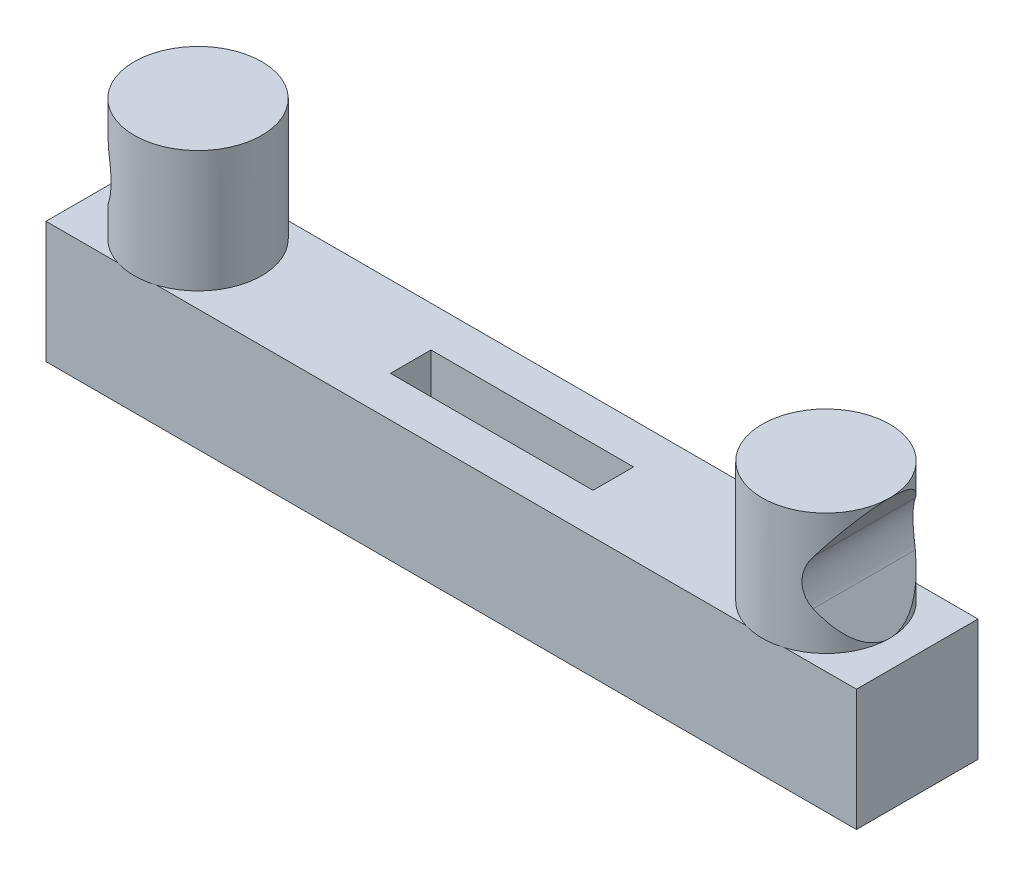
ISO-10303-21;
HEADER;
FILE_DESCRIPTION(('STEP AP214'),'2;1');
FILE_NAME('part.step','',(''),(''),'','','');
FILE_SCHEMA(('AUTOMOTIVE_DESIGN { 1 0 10303 214 1 1 1 1 }'));
ENDSEC;
DATA;
#1=APPLICATION_CONTEXT('core data for automotive mechanical design processes');
#2=APPLICATION_PROTOCOL_DEFINITION('international standard','automotive_design',2000,#1);
#3=PRODUCT_CONTEXT('',#1,'mechanical');
#4=PRODUCT('Part','Part','',(#3));
#5=PRODUCT_RELATED_PRODUCT_CATEGORY('part','',(#4));
#6=PRODUCT_DEFINITION_FORMATION('','',#4);
#7=PRODUCT_DEFINITION_CONTEXT('part definition',#1,'design');
#8=PRODUCT_DEFINITION('design','',#6,#7);
#9=PRODUCT_DEFINITION_SHAPE('','',#8);
#10=(LENGTH_UNIT() NAMED_UNIT(*) SI_UNIT(.MILLI.,.METRE.));
#11=(NAMED_UNIT(*) PLANE_ANGLE_UNIT() SI_UNIT($,.RADIAN.));
#12=(NAMED_UNIT(*) SI_UNIT($,.STERADIAN.) SOLID_ANGLE_UNIT());
#13=UNCERTAINTY_MEASURE_WITH_UNIT(LENGTH_MEASURE(1.E-05),#10,'distance_accuracy_value','');
#14=(GEOMETRIC_REPRESENTATION_CONTEXT(3) GLOBAL_UNCERTAINTY_ASSIGNED_CONTEXT((#13)) GLOBAL_UNIT_ASSIGNED_CONTEXT((#10,
#11,#12)) REPRESENTATION_CONTEXT('',''));
#15=CARTESIAN_POINT('',(0.,0.,0.));
#16=DIRECTION('',(0.,0.,1.));
#17=DIRECTION('',(1.,0.,0.));
#18=AXIS2_PLACEMENT_3D('',#15,#16,#17);
#19=CARTESIAN_POINT('',(0.,7.62,0.));
#20=DIRECTION('',(0.,1.,0.));
#21=DIRECTION('',(0.,0.,1.));
#22=AXIS2_PLACEMENT_3D('',#19,#20,#21);
#23=PLANE('',#22);
#24=CARTESIAN_POINT('',(19.6812405921278,7.62,0.));
#25=DIRECTION('',(0.,-1.,0.));
#26=DIRECTION('',(0.,0.,1.));
#27=AXIS2_PLACEMENT_3D('',#24,#25,#26);
#28=CIRCLE('',#27,4.);
#29=CARTESIAN_POINT('',(20.8993949337447,7.62,-3.81));
#30=VERTEX_POINT('',#29);
#31=CARTESIAN_POINT('',(23.6812405921278,7.62,0.));
#32=VERTEX_POINT('',#31);
#33=EDGE_CURVE('E169',#30,#32,#28,.T.);
#34=ORIENTED_EDGE('',*,*,#33,.T.);
#35=CARTESIAN_POINT('',(20.8993949337447,7.62,3.81));
#36=VERTEX_POINT('',#35);
#37=EDGE_CURVE('E173',#32,#36,#28,.T.);
#38=ORIENTED_EDGE('',*,*,#37,.T.);
#39=DIRECTION('',(1.,0.,0.));
#40=VECTOR('',#39,1.);
#41=CARTESIAN_POINT('',(-25.4,7.62,3.81));
#42=LINE('',#41,#40);
#43=CARTESIAN_POINT('',(25.4,7.62,3.81));
#44=VERTEX_POINT('',#43);
#45=EDGE_CURVE('E325',#36,#44,#42,.T.);
#46=ORIENTED_EDGE('',*,*,#45,.T.);
#47=DIRECTION('',(0.,0.,-1.));
#48=VECTOR('',#47,1.);
#49=CARTESIAN_POINT('',(25.4,7.62,-3.81));
#50=LINE('',#49,#48);
#51=CARTESIAN_POINT('',(25.4,7.62,-3.81));
#52=VERTEX_POINT('',#51);
#53=EDGE_CURVE('E320',#44,#52,#50,.T.);
#54=ORIENTED_EDGE('',*,*,#53,.T.);
#55=DIRECTION('',(-1.,0.,0.));
#56=VECTOR('',#55,1.);
#57=CARTESIAN_POINT('',(-25.4,7.62,-3.81));
#58=LINE('',#57,#56);
#59=EDGE_CURVE('E182',#52,#30,#58,.T.);
#60=ORIENTED_EDGE('',*,*,#59,.T.);
#61=EDGE_LOOP('',(#34,#38,#46,#54,#60));
#62=FACE_BOUND('',#61,.T.);
#63=ADVANCED_FACE('F32',(#62),#23,.T.);
#64=CARTESIAN_POINT('',(-19.6812405921278,15.24,0.));
#65=DIRECTION('',(0.,-1.,0.));
#66=DIRECTION('',(0.,0.,-1.));
#67=AXIS2_PLACEMENT_3D('',#64,#65,#66);
#68=CYLINDRICAL_SURFACE('',#67,4.);
#69=CARTESIAN_POINT('',(-19.6812405921278,9.24,0.));
#70=DIRECTION('',(-0.832050294337843,-0.554700196225229,0.));
#71=DIRECTION('',(0.554700196225229,-0.832050294337844,0.));
#72=AXIS2_PLACEMENT_3D('',#69,#70,#71);
#73=ELLIPSE('',#72,7.21110255092798,4.);
#74=CARTESIAN_POINT('',(-22.0805329244026,12.8389384984121,3.20053062855017));
#75=VERTEX_POINT('',#74);
#76=CARTESIAN_POINT('',(-23.6812405921278,15.24,0.));
#77=VERTEX_POINT('',#76);
#78=EDGE_CURVE('E283',#75,#77,#73,.T.);
#79=ORIENTED_EDGE('',*,*,#78,.F.);
#80=CARTESIAN_POINT('',(-22.0805329244026,12.8389384984121,3.20053062855017));
#81=CARTESIAN_POINT('',(-22.0489067233016,12.7915234511022,3.22423730832494));
#82=CARTESIAN_POINT('',(-22.0185184169344,12.7424586459574,3.24628773190031));
#83=CARTESIAN_POINT('',(-21.9606564488741,12.6413692389897,3.28717532162549));
#84=CARTESIAN_POINT('',(-21.9331824658725,12.5893449644263,3.30601284214193));
#85=CARTESIAN_POINT('',(-21.8816146143263,12.4827355756022,3.34055643539148));
#86=CARTESIAN_POINT('',(-21.8575163664271,12.4281539041404,3.35626657664572));
#87=CARTESIAN_POINT('',(-21.813009586644,12.3167753027886,3.38470889238804));
#88=CARTESIAN_POINT('',(-21.7926010110484,12.2599783991522,3.39744110215646));
#89=CARTESIAN_POINT('',(-21.7373505187254,12.0868096455319,3.43137244625954));
#90=CARTESIAN_POINT('',(-21.7084584277017,11.9676077442597,3.44832266510764));
#91=CARTESIAN_POINT('',(-21.6681802775251,11.7253671703762,3.47168740689977));
#92=CARTESIAN_POINT('',(-21.656792458385,11.6023288847679,3.47810298906537));
#93=CARTESIAN_POINT('',(-21.6520287761371,11.3553873259401,3.48080498701623));
#94=CARTESIAN_POINT('',(-21.6587092400156,11.231482551562,3.47705972676132));
#95=CARTESIAN_POINT('',(-21.6898861260089,10.9866476394987,3.45914195181548));
#96=CARTESIAN_POINT('',(-21.7143929601998,10.8657192829825,3.44496334312906));
#97=CARTESIAN_POINT('',(-21.7801150004832,10.6299871856857,3.40531801349452));
#98=CARTESIAN_POINT('',(-21.8213744349193,10.5152005746636,3.3798213952522));
#99=CARTESIAN_POINT('',(-21.8938916826444,10.3506536739787,3.33241570364247));
#100=CARTESIAN_POINT('',(-21.9198156971138,10.2971083378547,3.31510085465674));
#101=CARTESIAN_POINT('',(-21.9748180571208,10.1928439602977,3.27728817226968));
#102=CARTESIAN_POINT('',(-22.0038949088236,10.142123597468,3.25679184430444));
#103=CARTESIAN_POINT('',(-22.0493994631811,10.0686141688164,3.22368903165787));
#104=CARTESIAN_POINT('',(-22.0648159442359,10.0446320798467,3.21231277329923));
#105=CARTESIAN_POINT('',(-22.0805329244026,10.0210615015879,3.20053062855017));
#106=B_SPLINE_CURVE_WITH_KNOTS('',3,(#80,#81,#82,#83,#84,#85,#86,#87,#88,#89,#90,#91,#92,#93,
#94,#95,#96,#97,#98,#99,#100,#101,#102,#103,#104,#105),.UNSPECIFIED.,.F.,.F.,(4,2,2,2,2,2,2,2,2,
2,2,2,4),(0.,0.1851246104739,0.370228789436317,0.555090562905433,0.739950146156615,
1.10949115199492,1.47899499947704,1.84965208372786,2.2205258364186,2.59238516194598,
2.77808005467902,2.96368734527614,3.05574402558873),.UNSPECIFIED.);
#107=CARTESIAN_POINT('',(-22.0805329244026,10.0210615015879,3.20053062855017));
#108=VERTEX_POINT('',#107);
#109=EDGE_CURVE('E163',#75,#108,#106,.T.);
#110=ORIENTED_EDGE('',*,*,#109,.T.);
#111=CARTESIAN_POINT('',(-19.6812405921278,13.62,0.));
#112=DIRECTION('',(-0.832050294337844,0.554700196225229,0.));
#113=DIRECTION('',(-0.554700196225229,-0.832050294337844,0.));
#114=AXIS2_PLACEMENT_3D('',#111,#112,#113);
#115=ELLIPSE('',#114,7.21110255092798,4.);
#116=CARTESIAN_POINT('',(-23.6812405921278,7.62,0.));
#117=VERTEX_POINT('',#116);
#118=EDGE_CURVE('E278',#117,#108,#115,.T.);
#119=ORIENTED_EDGE('',*,*,#118,.F.);
#120=CARTESIAN_POINT('',(-19.6812405921278,7.62,0.));
#121=DIRECTION('',(0.,1.,0.));
#122=DIRECTION('',(0.,0.,1.));
#123=AXIS2_PLACEMENT_3D('',#120,#121,#122);
#124=CIRCLE('',#123,4.);
#125=CARTESIAN_POINT('',(-20.8993949337447,7.62,3.81));
#126=VERTEX_POINT('',#125);
#127=EDGE_CURVE('E260',#117,#126,#124,.T.);
#128=ORIENTED_EDGE('',*,*,#127,.T.);
#129=CARTESIAN_POINT('',(-18.463086250511,7.62,3.81));
#130=VERTEX_POINT('',#129);
#131=EDGE_CURVE('E270',#126,#130,#124,.T.);
#132=ORIENTED_EDGE('',*,*,#131,.T.);
#133=CARTESIAN_POINT('',(-18.463086250511,7.62,-3.81));
#134=VERTEX_POINT('',#133);
#135=EDGE_CURVE('E271',#130,#134,#124,.T.);
#136=ORIENTED_EDGE('',*,*,#135,.T.);
#137=CARTESIAN_POINT('',(-20.8993949337447,7.62,-3.81));
#138=VERTEX_POINT('',#137);
#139=EDGE_CURVE('E277',#134,#138,#124,.T.);
#140=ORIENTED_EDGE('',*,*,#139,.T.);
#141=EDGE_CURVE('E262',#138,#117,#124,.T.);
#142=ORIENTED_EDGE('',*,*,#141,.T.);
#143=CARTESIAN_POINT('',(-22.0805329244026,10.0210615015879,-3.20053062855017));
#144=VERTEX_POINT('',#143);
#145=EDGE_CURVE('E275',#144,#117,#115,.T.);
#146=ORIENTED_EDGE('',*,*,#145,.F.);
#147=CARTESIAN_POINT('',(-22.0805329244026,10.0210615015879,-3.20053062855017));
#148=CARTESIAN_POINT('',(-22.0489067233016,10.0684765488978,-3.22423730832494));
#149=CARTESIAN_POINT('',(-22.0185184169344,10.1175413540427,-3.24628773190031));
#150=CARTESIAN_POINT('',(-21.9606564488741,10.2186307610103,-3.28717532162549));
#151=CARTESIAN_POINT('',(-21.9331824658725,10.2706550355737,-3.30601284214193));
#152=CARTESIAN_POINT('',(-21.8816146143263,10.3772644243978,-3.34055643539148));
#153=CARTESIAN_POINT('',(-21.8575163664271,10.4318460958596,-3.35626657664572));
#154=CARTESIAN_POINT('',(-21.813009586644,10.5432246972114,-3.38470889238804));
#155=CARTESIAN_POINT('',(-21.7926010110484,10.6000216008478,-3.39744110215646));
#156=CARTESIAN_POINT('',(-21.7373505187254,10.7731903544681,-3.43137244625954));
#157=CARTESIAN_POINT('',(-21.7084584277017,10.8923922557403,-3.44832266510764));
#158=CARTESIAN_POINT('',(-21.6681802775251,11.1346328296238,-3.47168740689977));
#159=CARTESIAN_POINT('',(-21.656792458385,11.2576711152321,-3.47810298906537));
#160=CARTESIAN_POINT('',(-21.6520287761371,11.5046126740599,-3.48080498701623));
#161=CARTESIAN_POINT('',(-21.6587092400156,11.628517448438,-3.47705972676132));
#162=CARTESIAN_POINT('',(-21.6898861260089,11.8733523605013,-3.45914195181548));
#163=CARTESIAN_POINT('',(-21.7143929601998,11.9942807170175,-3.44496334312906));
#164=CARTESIAN_POINT('',(-21.7801150004832,12.2300128143143,-3.40531801349452));
#165=CARTESIAN_POINT('',(-21.8213744349193,12.3447994253364,-3.3798213952522));
#166=CARTESIAN_POINT('',(-21.8938916826444,12.5093463260213,-3.33241570364247));
#167=CARTESIAN_POINT('',(-21.9198156971138,12.5628916621453,-3.31510085465675));
#168=CARTESIAN_POINT('',(-21.9748180571208,12.6671560397023,-3.27728817226968));
#169=CARTESIAN_POINT('',(-22.0038949088236,12.717876402532,-3.25679184430444));
#170=CARTESIAN_POINT('',(-22.0493994631811,12.7913858311836,-3.22368903165787));
#171=CARTESIAN_POINT('',(-22.0648159442359,12.8153679201532,-3.21231277329923));
#172=CARTESIAN_POINT('',(-22.0805329244026,12.8389384984121,-3.20053062855017));
#173=B_SPLINE_CURVE_WITH_KNOTS('',3,(#147,#148,#149,#150,#151,#152,#153,#154,#155,#156,#157,
#158,#159,#160,#161,#162,#163,#164,#165,#166,#167,#168,#169,#170,#171,#172),.UNSPECIFIED.,.F.,
.F.,(4,2,2,2,2,2,2,2,2,2,2,2,4),(0.,0.185124610473902,0.370228789436315,0.555090562905435,
0.739950146156615,1.10949115199492,1.47899499947704,1.84965208372786,2.2205258364186,
2.59238516194598,2.77808005467901,2.96368734527614,3.05574402558873),.UNSPECIFIED.);
#174=CARTESIAN_POINT('',(-22.0805329244026,12.8389384984121,-3.20053062855016));
#175=VERTEX_POINT('',#174);
#176=EDGE_CURVE('E351',#144,#175,#173,.T.);
#177=ORIENTED_EDGE('',*,*,#176,.T.);
#178=EDGE_CURVE('E201',#77,#175,#73,.T.);
#179=ORIENTED_EDGE('',*,*,#178,.F.);
#180=CARTESIAN_POINT('',(-19.6812405921278,15.24,0.));
#181=DIRECTION('',(0.,1.,0.));
#182=DIRECTION('',(0.,0.,1.));
#183=AXIS2_PLACEMENT_3D('',#180,#181,#182);
#184=CIRCLE('',#183,4.);
#185=EDGE_CURVE('E282',#77,#77,#184,.T.);
#186=ORIENTED_EDGE('',*,*,#185,.F.);
#187=EDGE_LOOP('',(#79,#110,#119,#128,#132,#136,#140,#142,#146,#177,#179,#186));
#188=FACE_BOUND('',#187,.T.);
#189=ADVANCED_FACE('F233',(#188),#68,.T.);
#190=CARTESIAN_POINT('',(18.463086250511,7.62,3.81));
#191=VERTEX_POINT('',#190);
#192=CARTESIAN_POINT('',(18.463086250511,7.62,-3.81));
#193=VERTEX_POINT('',#192);
#194=EDGE_CURVE('E180',#191,#193,#28,.T.);
#195=ORIENTED_EDGE('',*,*,#194,.T.);
#196=EDGE_CURVE('E207',#193,#134,#58,.T.);
#197=ORIENTED_EDGE('',*,*,#196,.T.);
#198=ORIENTED_EDGE('',*,*,#135,.F.);
#199=EDGE_CURVE('E210',#130,#191,#42,.T.);
#200=ORIENTED_EDGE('',*,*,#199,.T.);
#201=EDGE_LOOP('',(#195,#197,#198,#200));
#202=FACE_BOUND('',#201,.T.);
#203=DIRECTION('',(0.,0.,-1.));
#204=VECTOR('',#203,1.);
#205=CARTESIAN_POINT('',(6.35,7.62,-1.27));
#206=LINE('',#205,#204);
#207=CARTESIAN_POINT('',(6.35,7.62,1.27));
#208=VERTEX_POINT('',#207);
#209=CARTESIAN_POINT('',(6.35,7.62,-1.27));
#210=VERTEX_POINT('',#209);
#211=EDGE_CURVE('E290',#208,#210,#206,.T.);
#212=ORIENTED_EDGE('',*,*,#211,.F.);
#213=DIRECTION('',(1.,0.,0.));
#214=VECTOR('',#213,1.);
#215=CARTESIAN_POINT('',(-6.35,7.62,1.27));
#216=LINE('',#215,#214);
#217=CARTESIAN_POINT('',(-6.35,7.62,1.27));
#218=VERTEX_POINT('',#217);
#219=EDGE_CURVE('E307',#218,#208,#216,.T.);
#220=ORIENTED_EDGE('',*,*,#219,.F.);
#221=DIRECTION('',(0.,0.,1.));
#222=VECTOR('',#221,1.);
#223=CARTESIAN_POINT('',(-6.35,7.62,-1.27));
#224=LINE('',#223,#222);
#225=CARTESIAN_POINT('',(-6.35,7.62,-1.27));
#226=VERTEX_POINT('',#225);
#227=EDGE_CURVE('E299',#226,#218,#224,.T.);
#228=ORIENTED_EDGE('',*,*,#227,.F.);
#229=DIRECTION('',(-1.,0.,0.));
#230=VECTOR('',#229,1.);
#231=CARTESIAN_POINT('',(-6.35,7.62,-1.27));
#232=LINE('',#231,#230);
#233=EDGE_CURVE('E293',#210,#226,#232,.T.);
#234=ORIENTED_EDGE('',*,*,#233,.F.);
#235=EDGE_LOOP('',(#212,#220,#228,#234));
#236=FACE_BOUND('',#235,.T.);
#237=ADVANCED_FACE('F205',(#202,#236),#23,.T.);
#238=CARTESIAN_POINT('',(25.4,7.62,-3.81));
#239=DIRECTION('',(-1.,0.,0.));
#240=DIRECTION('',(0.,0.,1.));
#241=AXIS2_PLACEMENT_3D('',#238,#239,#240);
#242=PLANE('',#241);
#243=DIRECTION('',(0.,0.,-1.));
#244=VECTOR('',#243,1.);
#245=CARTESIAN_POINT('',(25.4,0.,-3.81));
#246=LINE('',#245,#244);
#247=CARTESIAN_POINT('',(25.4,0.,3.81));
#248=VERTEX_POINT('',#247);
#249=CARTESIAN_POINT('',(25.4,0.,-3.81));
#250=VERTEX_POINT('',#249);
#251=EDGE_CURVE('E313',#248,#250,#246,.T.);
#252=ORIENTED_EDGE('',*,*,#251,.T.);
#253=DIRECTION('',(0.,-1.,0.));
#254=VECTOR('',#253,1.);
#255=CARTESIAN_POINT('',(25.4,7.62,-3.81));
#256=LINE('',#255,#254);
#257=EDGE_CURVE('E268',#52,#250,#256,.T.);
#258=ORIENTED_EDGE('',*,*,#257,.F.);
#259=ORIENTED_EDGE('',*,*,#53,.F.);
#260=DIRECTION('',(0.,-1.,0.));
#261=VECTOR('',#260,1.);
#262=CARTESIAN_POINT('',(25.4,7.62,3.81));
#263=LINE('',#262,#261);
#264=EDGE_CURVE('E327',#44,#248,#263,.T.);
#265=ORIENTED_EDGE('',*,*,#264,.T.);
#266=EDGE_LOOP('',(#252,#258,#259,#265));
#267=FACE_BOUND('',#266,.T.);
#268=ADVANCED_FACE('F244',(#267),#242,.F.);
#269=CARTESIAN_POINT('',(-25.4,7.62,-3.81));
#270=DIRECTION('',(0.,0.,1.));
#271=DIRECTION('',(1.,0.,0.));
#272=AXIS2_PLACEMENT_3D('',#269,#270,#271);
#273=PLANE('',#272);
#274=DIRECTION('',(-1.,0.,0.));
#275=VECTOR('',#274,1.);
#276=CARTESIAN_POINT('',(-25.4,0.,-3.81));
#277=LINE('',#276,#275);
#278=CARTESIAN_POINT('',(-25.4,0.,-3.81));
#279=VERTEX_POINT('',#278);
#280=EDGE_CURVE('E331',#250,#279,#277,.T.);
#281=ORIENTED_EDGE('',*,*,#280,.T.);
#282=DIRECTION('',(0.,-1.,0.));
#283=VECTOR('',#282,1.);
#284=CARTESIAN_POINT('',(-25.4,7.62,-3.81));
#285=LINE('',#284,#283);
#286=CARTESIAN_POINT('',(-25.4,7.62,-3.81));
#287=VERTEX_POINT('',#286);
#288=EDGE_CURVE('E341',#287,#279,#285,.T.);
#289=ORIENTED_EDGE('',*,*,#288,.F.);
#290=EDGE_CURVE('E218',#138,#287,#58,.T.);
#291=ORIENTED_EDGE('',*,*,#290,.F.);
#292=EDGE_CURVE('E215',#134,#138,#58,.T.);
#293=ORIENTED_EDGE('',*,*,#292,.F.);
#294=ORIENTED_EDGE('',*,*,#196,.F.);
#295=DIRECTION('',(-1.,0.,0.));
#296=VECTOR('',#295,1.);
#297=CARTESIAN_POINT('',(-25.4,7.62,-3.81));
#298=LINE('',#297,#296);
#299=EDGE_CURVE('E198',#30,#193,#298,.T.);
#300=ORIENTED_EDGE('',*,*,#299,.F.);
#301=ORIENTED_EDGE('',*,*,#59,.F.);
#302=ORIENTED_EDGE('',*,*,#257,.T.);
#303=EDGE_LOOP('',(#281,#289,#291,#293,#294,#300,#301,#302));
#304=FACE_BOUND('',#303,.T.);
#305=ADVANCED_FACE('F212',(#304),#273,.F.);
#306=CARTESIAN_POINT('',(-25.4,7.62,-3.81));
#307=DIRECTION('',(1.,0.,0.));
#308=DIRECTION('',(0.,0.,-1.));
#309=AXIS2_PLACEMENT_3D('',#306,#307,#308);
#310=PLANE('',#309);
#311=DIRECTION('',(0.,0.,1.));
#312=VECTOR('',#311,1.);
#313=CARTESIAN_POINT('',(-25.4,0.,-3.81));
#314=LINE('',#313,#312);
#315=CARTESIAN_POINT('',(-25.4,0.,3.81));
#316=VERTEX_POINT('',#315);
#317=EDGE_CURVE('E333',#279,#316,#314,.T.);
#318=ORIENTED_EDGE('',*,*,#317,.T.);
#319=DIRECTION('',(0.,-1.,0.));
#320=VECTOR('',#319,1.);
#321=CARTESIAN_POINT('',(-25.4,7.62,3.81));
#322=LINE('',#321,#320);
#323=CARTESIAN_POINT('',(-25.4,7.62,3.81));
#324=VERTEX_POINT('',#323);
#325=EDGE_CURVE('E338',#324,#316,#322,.T.);
#326=ORIENTED_EDGE('',*,*,#325,.F.);
#327=DIRECTION('',(0.,0.,1.));
#328=VECTOR('',#327,1.);
#329=CARTESIAN_POINT('',(-25.4,7.62,-3.81));
#330=LINE('',#329,#328);
#331=EDGE_CURVE('E323',#287,#324,#330,.T.);
#332=ORIENTED_EDGE('',*,*,#331,.F.);
#333=ORIENTED_EDGE('',*,*,#288,.T.);
#334=EDGE_LOOP('',(#318,#326,#332,#333));
#335=FACE_BOUND('',#334,.T.);
#336=ADVANCED_FACE('F255',(#335),#310,.F.);
#337=CARTESIAN_POINT('',(-25.4,7.62,3.81));
#338=DIRECTION('',(0.,0.,-1.));
#339=DIRECTION('',(-1.,0.,0.));
#340=AXIS2_PLACEMENT_3D('',#337,#338,#339);
#341=PLANE('',#340);
#342=DIRECTION('',(1.,0.,0.));
#343=VECTOR('',#342,1.);
#344=CARTESIAN_POINT('',(-25.4,0.,3.81));
#345=LINE('',#344,#343);
#346=EDGE_CURVE('E321',#316,#248,#345,.T.);
#347=ORIENTED_EDGE('',*,*,#346,.T.);
#348=ORIENTED_EDGE('',*,*,#264,.F.);
#349=ORIENTED_EDGE('',*,*,#45,.F.);
#350=EDGE_CURVE('E384',#191,#36,#42,.T.);
#351=ORIENTED_EDGE('',*,*,#350,.F.);
#352=ORIENTED_EDGE('',*,*,#199,.F.);
#353=EDGE_CURVE('E328',#126,#130,#42,.T.);
#354=ORIENTED_EDGE('',*,*,#353,.F.);
#355=EDGE_CURVE('E264',#324,#126,#42,.T.);
#356=ORIENTED_EDGE('',*,*,#355,.F.);
#357=ORIENTED_EDGE('',*,*,#325,.T.);
#358=EDGE_LOOP('',(#347,#348,#349,#351,#352,#354,#356,#357));
#359=FACE_BOUND('',#358,.T.);
#360=ADVANCED_FACE('F247',(#359),#341,.F.);
#361=ORIENTED_EDGE('',*,*,#127,.F.);
#362=ORIENTED_EDGE('',*,*,#141,.F.);
#363=ORIENTED_EDGE('',*,*,#290,.T.);
#364=ORIENTED_EDGE('',*,*,#331,.T.);
#365=ORIENTED_EDGE('',*,*,#355,.T.);
#366=EDGE_LOOP('',(#361,#362,#363,#364,#365));
#367=FACE_BOUND('',#366,.T.);
#368=ADVANCED_FACE('F235',(#367),#23,.T.);
#369=CARTESIAN_POINT('',(0.,0.,0.));
#370=DIRECTION('',(0.,1.,0.));
#371=DIRECTION('',(0.,0.,1.));
#372=AXIS2_PLACEMENT_3D('',#369,#370,#371);
#373=PLANE('',#372);
#374=DIRECTION('',(1.,0.,0.));
#375=VECTOR('',#374,1.);
#376=CARTESIAN_POINT('',(-6.35,0.,1.27));
#377=LINE('',#376,#375);
#378=CARTESIAN_POINT('',(-6.35,0.,1.27));
#379=VERTEX_POINT('',#378);
#380=CARTESIAN_POINT('',(6.35,0.,1.27));
#381=VERTEX_POINT('',#380);
#382=EDGE_CURVE('E302',#379,#381,#377,.T.);
#383=ORIENTED_EDGE('',*,*,#382,.T.);
#384=DIRECTION('',(0.,0.,-1.));
#385=VECTOR('',#384,1.);
#386=CARTESIAN_POINT('',(6.35,0.,-1.27));
#387=LINE('',#386,#385);
#388=CARTESIAN_POINT('',(6.35,0.,-1.27));
#389=VERTEX_POINT('',#388);
#390=EDGE_CURVE('E310',#381,#389,#387,.T.);
#391=ORIENTED_EDGE('',*,*,#390,.T.);
#392=DIRECTION('',(-1.,0.,0.));
#393=VECTOR('',#392,1.);
#394=CARTESIAN_POINT('',(-6.35,0.,-1.27));
#395=LINE('',#394,#393);
#396=CARTESIAN_POINT('',(-6.35,0.,-1.27));
#397=VERTEX_POINT('',#396);
#398=EDGE_CURVE('E583',#389,#397,#395,.T.);
#399=ORIENTED_EDGE('',*,*,#398,.T.);
#400=DIRECTION('',(0.,0.,1.));
#401=VECTOR('',#400,1.);
#402=CARTESIAN_POINT('',(-6.35,0.,-1.27));
#403=LINE('',#402,#401);
#404=EDGE_CURVE('E587',#397,#379,#403,.T.);
#405=ORIENTED_EDGE('',*,*,#404,.T.);
#406=EDGE_LOOP('',(#383,#391,#399,#405));
#407=FACE_BOUND('',#406,.T.);
#408=ORIENTED_EDGE('',*,*,#251,.F.);
#409=ORIENTED_EDGE('',*,*,#346,.F.);
#410=ORIENTED_EDGE('',*,*,#317,.F.);
#411=ORIENTED_EDGE('',*,*,#280,.F.);
#412=EDGE_LOOP('',(#408,#409,#410,#411));
#413=FACE_BOUND('',#412,.T.);
#414=ADVANCED_FACE('F246',(#407,#413),#373,.F.);
#415=CARTESIAN_POINT('',(6.35,0.,-1.27));
#416=DIRECTION('',(1.,0.,0.));
#417=DIRECTION('',(0.,0.,-1.));
#418=AXIS2_PLACEMENT_3D('',#415,#416,#417);
#419=PLANE('',#418);
#420=ORIENTED_EDGE('',*,*,#211,.T.);
#421=DIRECTION('',(0.,1.,0.));
#422=VECTOR('',#421,1.);
#423=CARTESIAN_POINT('',(6.35,0.,-1.27));
#424=LINE('',#423,#422);
#425=EDGE_CURVE('E318',#389,#210,#424,.T.);
#426=ORIENTED_EDGE('',*,*,#425,.F.);
#427=ORIENTED_EDGE('',*,*,#390,.F.);
#428=DIRECTION('',(0.,1.,0.));
#429=VECTOR('',#428,1.);
#430=CARTESIAN_POINT('',(6.35,0.,1.27));
#431=LINE('',#430,#429);
#432=EDGE_CURVE('E311',#381,#208,#431,.T.);
#433=ORIENTED_EDGE('',*,*,#432,.T.);
#434=EDGE_LOOP('',(#420,#426,#427,#433));
#435=FACE_BOUND('',#434,.T.);
#436=ADVANCED_FACE('F253',(#435),#419,.F.);
#437=CARTESIAN_POINT('',(-6.35,0.,1.27));
#438=DIRECTION('',(0.,0.,1.));
#439=DIRECTION('',(1.,0.,0.));
#440=AXIS2_PLACEMENT_3D('',#437,#438,#439);
#441=PLANE('',#440);
#442=ORIENTED_EDGE('',*,*,#219,.T.);
#443=ORIENTED_EDGE('',*,*,#432,.F.);
#444=ORIENTED_EDGE('',*,*,#382,.F.);
#445=DIRECTION('',(0.,1.,0.));
#446=VECTOR('',#445,1.);
#447=CARTESIAN_POINT('',(-6.35,0.,1.27));
#448=LINE('',#447,#446);
#449=EDGE_CURVE('E314',#379,#218,#448,.T.);
#450=ORIENTED_EDGE('',*,*,#449,.T.);
#451=EDGE_LOOP('',(#442,#443,#444,#450));
#452=FACE_BOUND('',#451,.T.);
#453=ADVANCED_FACE('F522',(#452),#441,.F.);
#454=CARTESIAN_POINT('',(-6.35,0.,-1.27));
#455=DIRECTION('',(-1.,0.,0.));
#456=DIRECTION('',(0.,0.,1.));
#457=AXIS2_PLACEMENT_3D('',#454,#455,#456);
#458=PLANE('',#457);
#459=ORIENTED_EDGE('',*,*,#227,.T.);
#460=ORIENTED_EDGE('',*,*,#449,.F.);
#461=ORIENTED_EDGE('',*,*,#404,.F.);
#462=DIRECTION('',(0.,1.,0.));
#463=VECTOR('',#462,1.);
#464=CARTESIAN_POINT('',(-6.35,0.,-1.27));
#465=LINE('',#464,#463);
#466=EDGE_CURVE('E316',#397,#226,#465,.T.);
#467=ORIENTED_EDGE('',*,*,#466,.T.);
#468=EDGE_LOOP('',(#459,#460,#461,#467));
#469=FACE_BOUND('',#468,.T.);
#470=ADVANCED_FACE('F513',(#469),#458,.F.);
#471=CARTESIAN_POINT('',(-6.35,0.,-1.27));
#472=DIRECTION('',(0.,0.,-1.));
#473=DIRECTION('',(-1.,0.,0.));
#474=AXIS2_PLACEMENT_3D('',#471,#472,#473);
#475=PLANE('',#474);
#476=ORIENTED_EDGE('',*,*,#233,.T.);
#477=ORIENTED_EDGE('',*,*,#466,.F.);
#478=ORIENTED_EDGE('',*,*,#398,.F.);
#479=ORIENTED_EDGE('',*,*,#425,.T.);
#480=EDGE_LOOP('',(#476,#477,#478,#479));
#481=FACE_BOUND('',#480,.T.);
#482=ADVANCED_FACE('F397',(#481),#475,.F.);
#483=CARTESIAN_POINT('',(-19.6812405921278,7.62,0.));
#484=DIRECTION('',(0.,1.,0.));
#485=DIRECTION('',(0.,0.,1.));
#486=AXIS2_PLACEMENT_3D('',#483,#484,#485);
#487=PLANE('',#486);
#488=ORIENTED_EDGE('',*,*,#139,.F.);
#489=ORIENTED_EDGE('',*,*,#292,.T.);
#490=EDGE_LOOP('',(#488,#489));
#491=FACE_BOUND('',#490,.T.);
#492=ADVANCED_FACE('F390',(#491),#487,.F.);
#493=ORIENTED_EDGE('',*,*,#131,.F.);
#494=ORIENTED_EDGE('',*,*,#353,.T.);
#495=EDGE_LOOP('',(#493,#494));
#496=FACE_BOUND('',#495,.T.);
#497=ADVANCED_FACE('F387',(#496),#487,.F.);
#498=CARTESIAN_POINT('',(-19.6812405921278,15.24,0.));
#499=DIRECTION('',(0.,1.,0.));
#500=DIRECTION('',(0.,0.,1.));
#501=AXIS2_PLACEMENT_3D('',#498,#499,#500);
#502=PLANE('',#501);
#503=ORIENTED_EDGE('',*,*,#185,.T.);
#504=EDGE_LOOP('',(#503));
#505=FACE_BOUND('',#504,.T.);
#506=ADVANCED_FACE('F389',(#505),#502,.T.);
#507=CARTESIAN_POINT('',(-23.6812405921278,7.62,7.62));
#508=DIRECTION('',(-0.832050294337844,0.554700196225229,0.));
#509=DIRECTION('',(-0.554700196225229,-0.832050294337844,0.));
#510=AXIS2_PLACEMENT_3D('',#507,#508,#509);
#511=PLANE('',#510);
#512=ORIENTED_EDGE('',*,*,#118,.T.);
#513=DIRECTION('',(0.,0.,-1.));
#514=VECTOR('',#513,1.);
#515=CARTESIAN_POINT('',(-22.0805329244026,10.0210615015879,-3.72403007506652));
#516=LINE('',#515,#514);
#517=EDGE_CURVE('E346',#108,#144,#516,.T.);
#518=ORIENTED_EDGE('',*,*,#517,.T.);
#519=ORIENTED_EDGE('',*,*,#145,.T.);
#520=EDGE_LOOP('',(#512,#518,#519));
#521=FACE_BOUND('',#520,.T.);
#522=ADVANCED_FACE('F395',(#521),#511,.T.);
#523=CARTESIAN_POINT('',(-21.1412405921278,11.43,7.62));
#524=DIRECTION('',(-0.832050294337843,-0.554700196225229,0.));
#525=DIRECTION('',(0.554700196225229,-0.832050294337844,0.));
#526=AXIS2_PLACEMENT_3D('',#523,#524,#525);
#527=PLANE('',#526);
#528=ORIENTED_EDGE('',*,*,#178,.T.);
#529=DIRECTION('',(0.,0.,-1.));
#530=VECTOR('',#529,1.);
#531=CARTESIAN_POINT('',(-22.0805329244026,12.8389384984121,3.72403007506653));
#532=LINE('',#531,#530);
#533=EDGE_CURVE('E349',#175,#75,#532,.F.);
#534=ORIENTED_EDGE('',*,*,#533,.T.);
#535=ORIENTED_EDGE('',*,*,#78,.T.);
#536=EDGE_LOOP('',(#528,#534,#535));
#537=FACE_BOUND('',#536,.T.);
#538=ADVANCED_FACE('F229',(#537),#527,.T.);
#539=CARTESIAN_POINT('',(-24.1939406720207,11.43,7.62));
#540=DIRECTION('',(0.,0.,1.));
#541=DIRECTION('',(1.,0.,0.));
#542=AXIS2_PLACEMENT_3D('',#539,#540,#541);
#543=CYLINDRICAL_SURFACE('',#542,2.54);
#544=ORIENTED_EDGE('',*,*,#109,.F.);
#545=ORIENTED_EDGE('',*,*,#533,.F.);
#546=ORIENTED_EDGE('',*,*,#176,.F.);
#547=ORIENTED_EDGE('',*,*,#517,.F.);
#548=EDGE_LOOP('',(#544,#545,#546,#547));
#549=FACE_BOUND('',#548,.T.);
#550=ADVANCED_FACE('F223',(#549),#543,.F.);
#551=CARTESIAN_POINT('',(19.6812405921278,7.62,0.));
#552=DIRECTION('',(0.,1.,0.));
#553=DIRECTION('',(0.,0.,1.));
#554=AXIS2_PLACEMENT_3D('',#551,#552,#553);
#555=PLANE('',#554);
#556=EDGE_CURVE('E184',#193,#30,#28,.T.);
#557=ORIENTED_EDGE('',*,*,#556,.T.);
#558=ORIENTED_EDGE('',*,*,#299,.T.);
#559=EDGE_LOOP('',(#557,#558));
#560=FACE_BOUND('',#559,.T.);
#561=ADVANCED_FACE('F220',(#560),#555,.F.);
#562=EDGE_CURVE('E176',#36,#191,#28,.T.);
#563=ORIENTED_EDGE('',*,*,#562,.T.);
#564=ORIENTED_EDGE('',*,*,#350,.T.);
#565=EDGE_LOOP('',(#563,#564));
#566=FACE_BOUND('',#565,.T.);
#567=ADVANCED_FACE('F222',(#566),#555,.F.);
#568=CARTESIAN_POINT('',(19.6812405921278,15.24,0.));
#569=DIRECTION('',(0.,-1.,0.));
#570=DIRECTION('',(0.,0.,-1.));
#571=AXIS2_PLACEMENT_3D('',#568,#569,#570);
#572=CYLINDRICAL_SURFACE('',#571,4.);
#573=CARTESIAN_POINT('',(19.6812405921278,13.62,0.));
#574=DIRECTION('',(-0.832050294337844,-0.554700196225229,0.));
#575=DIRECTION('',(0.554700196225229,-0.832050294337844,0.));
#576=AXIS2_PLACEMENT_3D('',#573,#574,#575);
#577=ELLIPSE('',#576,7.21110255092798,4.);
#578=CARTESIAN_POINT('',(22.0805329244026,10.0210615015879,-3.20053062855017));
#579=VERTEX_POINT('',#578);
#580=EDGE_CURVE('E160',#32,#579,#577,.F.);
#581=ORIENTED_EDGE('',*,*,#580,.F.);
#582=ORIENTED_EDGE('',*,*,#33,.F.);
#583=ORIENTED_EDGE('',*,*,#556,.F.);
#584=ORIENTED_EDGE('',*,*,#194,.F.);
#585=ORIENTED_EDGE('',*,*,#562,.F.);
#586=ORIENTED_EDGE('',*,*,#37,.F.);
#587=CARTESIAN_POINT('',(22.0805329244026,10.0210615015879,3.20053062855017));
#588=VERTEX_POINT('',#587);
#589=EDGE_CURVE('E158',#588,#32,#577,.F.);
#590=ORIENTED_EDGE('',*,*,#589,.F.);
#591=CARTESIAN_POINT('',(22.0805329244026,10.0210615015879,3.20053062855017));
#592=CARTESIAN_POINT('',(22.0489067233016,10.0684765488978,3.22423730832494));
#593=CARTESIAN_POINT('',(22.0185184169344,10.1175413540427,3.24628773190031));
#594=CARTESIAN_POINT('',(21.9606564488741,10.2186307610103,3.28717532162549));
#595=CARTESIAN_POINT('',(21.9331824658725,10.2706550355737,3.30601284214193));
#596=CARTESIAN_POINT('',(21.8816146143263,10.3772644243978,3.34055643539148));
#597=CARTESIAN_POINT('',(21.8575163664271,10.4318460958596,3.35626657664572));
#598=CARTESIAN_POINT('',(21.813009586644,10.5432246972114,3.38470889238804));
#599=CARTESIAN_POINT('',(21.7926010110484,10.6000216008478,3.39744110215646));
#600=CARTESIAN_POINT('',(21.7373505187254,10.7731903544681,3.43137244625954));
#601=CARTESIAN_POINT('',(21.7084584277017,10.8923922557403,3.44832266510764));
#602=CARTESIAN_POINT('',(21.6681802775251,11.1346328296238,3.47168740689977));
#603=CARTESIAN_POINT('',(21.656792458385,11.2576711152321,3.47810298906537));
#604=CARTESIAN_POINT('',(21.6520287761371,11.5046126740599,3.48080498701623));
#605=CARTESIAN_POINT('',(21.6587092400156,11.628517448438,3.47705972676132));
#606=CARTESIAN_POINT('',(21.6898861260089,11.8733523605013,3.45914195181548));
#607=CARTESIAN_POINT('',(21.7143929601998,11.9942807170175,3.44496334312906));
#608=CARTESIAN_POINT('',(21.7801150004832,12.2300128143143,3.40531801349452));
#609=CARTESIAN_POINT('',(21.8213744349193,12.3447994253364,3.3798213952522));
#610=CARTESIAN_POINT('',(21.8938916826444,12.5093463260213,3.33241570364247));
#611=CARTESIAN_POINT('',(21.9198156971138,12.5628916621453,3.31510085465675));
#612=CARTESIAN_POINT('',(21.9748180571208,12.6671560397023,3.27728817226968));
#613=CARTESIAN_POINT('',(22.0038949088236,12.717876402532,3.25679184430444));
#614=CARTESIAN_POINT('',(22.0493994631811,12.7913858311836,3.22368903165787));
#615=CARTESIAN_POINT('',(22.0648159442359,12.8153679201532,3.21231277329923));
#616=CARTESIAN_POINT('',(22.0805329244026,12.8389384984121,3.20053062855017));
#617=B_SPLINE_CURVE_WITH_KNOTS('',3,(#591,#592,#593,#594,#595,#596,#597,#598,#599,#600,#601,
#602,#603,#604,#605,#606,#607,#608,#609,#610,#611,#612,#613,#614,#615,#616),.UNSPECIFIED.,.F.,
.F.,(4,2,2,2,2,2,2,2,2,2,2,2,4),(0.,0.185124610473902,0.370228789436315,0.555090562905435,
0.739950146156615,1.10949115199492,1.47899499947704,1.84965208372786,2.2205258364186,
2.59238516194598,2.77808005467901,2.96368734527614,3.05574402558873),.UNSPECIFIED.);
#618=CARTESIAN_POINT('',(22.0805329244026,12.8389384984121,3.20053062855017));
#619=VERTEX_POINT('',#618);
#620=EDGE_CURVE('E11',#588,#619,#617,.T.);
#621=ORIENTED_EDGE('',*,*,#620,.T.);
#622=CARTESIAN_POINT('',(19.6812405921278,9.24,0.));
#623=DIRECTION('',(-0.832050294337843,0.554700196225229,0.));
#624=DIRECTION('',(-0.554700196225229,-0.832050294337844,0.));
#625=AXIS2_PLACEMENT_3D('',#622,#623,#624);
#626=ELLIPSE('',#625,7.21110255092798,4.);
#627=CARTESIAN_POINT('',(23.6812405921278,15.24,0.));
#628=VERTEX_POINT('',#627);
#629=EDGE_CURVE('E190',#628,#619,#626,.F.);
#630=ORIENTED_EDGE('',*,*,#629,.F.);
#631=CARTESIAN_POINT('',(19.6812405921278,15.24,0.));
#632=DIRECTION('',(0.,-1.,0.));
#633=DIRECTION('',(0.,0.,1.));
#634=AXIS2_PLACEMENT_3D('',#631,#632,#633);
#635=CIRCLE('',#634,4.);
#636=EDGE_CURVE('E196',#628,#628,#635,.T.);
#637=ORIENTED_EDGE('',*,*,#636,.T.);
#638=CARTESIAN_POINT('',(22.0805329244026,12.8389384984121,-3.20053062855016));
#639=VERTEX_POINT('',#638);
#640=EDGE_CURVE('E187',#639,#628,#626,.F.);
#641=ORIENTED_EDGE('',*,*,#640,.F.);
#642=CARTESIAN_POINT('',(22.0805329244026,12.8389384984121,-3.20053062855017));
#643=CARTESIAN_POINT('',(22.0489067233016,12.7915234511022,-3.22423730832494));
#644=CARTESIAN_POINT('',(22.0185184169344,12.7424586459574,-3.24628773190031));
#645=CARTESIAN_POINT('',(21.9606564488741,12.6413692389897,-3.28717532162549));
#646=CARTESIAN_POINT('',(21.9331824658725,12.5893449644263,-3.30601284214193));
#647=CARTESIAN_POINT('',(21.8816146143263,12.4827355756022,-3.34055643539148));
#648=CARTESIAN_POINT('',(21.8575163664271,12.4281539041404,-3.35626657664572));
#649=CARTESIAN_POINT('',(21.813009586644,12.3167753027886,-3.38470889238804));
#650=CARTESIAN_POINT('',(21.7926010110484,12.2599783991522,-3.39744110215646));
#651=CARTESIAN_POINT('',(21.7373505187254,12.0868096455319,-3.43137244625954));
#652=CARTESIAN_POINT('',(21.7084584277017,11.9676077442597,-3.44832266510764));
#653=CARTESIAN_POINT('',(21.6681802775251,11.7253671703762,-3.47168740689977));
#654=CARTESIAN_POINT('',(21.656792458385,11.6023288847679,-3.47810298906537));
#655=CARTESIAN_POINT('',(21.6520287761371,11.3553873259401,-3.48080498701623));
#656=CARTESIAN_POINT('',(21.6587092400156,11.231482551562,-3.47705972676132));
#657=CARTESIAN_POINT('',(21.6898861260089,10.9866476394987,-3.45914195181548));
#658=CARTESIAN_POINT('',(21.7143929601998,10.8657192829825,-3.44496334312906));
#659=CARTESIAN_POINT('',(21.7801150004832,10.6299871856857,-3.40531801349452));
#660=CARTESIAN_POINT('',(21.8213744349193,10.5152005746636,-3.3798213952522));
#661=CARTESIAN_POINT('',(21.8938916826444,10.3506536739787,-3.33241570364247));
#662=CARTESIAN_POINT('',(21.9198156971138,10.2971083378547,-3.31510085465674));
#663=CARTESIAN_POINT('',(21.9748180571208,10.1928439602977,-3.27728817226968));
#664=CARTESIAN_POINT('',(22.0038949088236,10.142123597468,-3.25679184430444));
#665=CARTESIAN_POINT('',(22.0493994631811,10.0686141688164,-3.22368903165787));
#666=CARTESIAN_POINT('',(22.0648159442359,10.0446320798467,-3.21231277329923));
#667=CARTESIAN_POINT('',(22.0805329244026,10.0210615015879,-3.20053062855017));
#668=B_SPLINE_CURVE_WITH_KNOTS('',3,(#642,#643,#644,#645,#646,#647,#648,#649,#650,#651,#652,
#653,#654,#655,#656,#657,#658,#659,#660,#661,#662,#663,#664,#665,#666,#667),.UNSPECIFIED.,.F.,
.F.,(4,2,2,2,2,2,2,2,2,2,2,2,4),(0.,0.1851246104739,0.370228789436317,0.555090562905433,
0.739950146156615,1.10949115199492,1.47899499947704,1.84965208372786,2.2205258364186,
2.59238516194598,2.77808005467902,2.96368734527614,3.05574402558873),.UNSPECIFIED.);
#669=EDGE_CURVE('E45',#639,#579,#668,.T.);
#670=ORIENTED_EDGE('',*,*,#669,.T.);
#671=EDGE_LOOP('',(#581,#582,#583,#584,#585,#586,#590,#621,#630,#637,#641,#670));
#672=FACE_BOUND('',#671,.T.);
#673=ADVANCED_FACE('F166',(#672),#572,.T.);
#674=CARTESIAN_POINT('',(19.6812405921278,15.24,0.));
#675=DIRECTION('',(0.,1.,0.));
#676=DIRECTION('',(0.,0.,1.));
#677=AXIS2_PLACEMENT_3D('',#674,#675,#676);
#678=PLANE('',#677);
#679=ORIENTED_EDGE('',*,*,#636,.F.);
#680=EDGE_LOOP('',(#679));
#681=FACE_BOUND('',#680,.T.);
#682=ADVANCED_FACE('F406',(#681),#678,.T.);
#683=CARTESIAN_POINT('',(21.1412405921278,11.43,7.62));
#684=DIRECTION('',(-0.832050294337843,0.554700196225229,0.));
#685=DIRECTION('',(-0.554700196225229,-0.832050294337844,0.));
#686=AXIS2_PLACEMENT_3D('',#683,#684,#685);
#687=PLANE('',#686);
#688=ORIENTED_EDGE('',*,*,#629,.T.);
#689=DIRECTION('',(0.,0.,-1.));
#690=VECTOR('',#689,1.);
#691=CARTESIAN_POINT('',(22.0805329244026,12.8389384984121,-3.72403007506652));
#692=LINE('',#691,#690);
#693=EDGE_CURVE('E171',#619,#639,#692,.T.);
#694=ORIENTED_EDGE('',*,*,#693,.T.);
#695=ORIENTED_EDGE('',*,*,#640,.T.);
#696=EDGE_LOOP('',(#688,#694,#695));
#697=FACE_BOUND('',#696,.T.);
#698=ADVANCED_FACE('F414',(#697),#687,.F.);
#699=CARTESIAN_POINT('',(23.6812405921278,7.62,7.62));
#700=DIRECTION('',(-0.832050294337844,-0.554700196225229,0.));
#701=DIRECTION('',(0.554700196225229,-0.832050294337844,0.));
#702=AXIS2_PLACEMENT_3D('',#699,#700,#701);
#703=PLANE('',#702);
#704=ORIENTED_EDGE('',*,*,#580,.T.);
#705=DIRECTION('',(0.,0.,-1.));
#706=VECTOR('',#705,1.);
#707=CARTESIAN_POINT('',(22.0805329244026,10.0210615015879,3.72403007506653));
#708=LINE('',#707,#706);
#709=EDGE_CURVE('E52',#579,#588,#708,.F.);
#710=ORIENTED_EDGE('',*,*,#709,.T.);
#711=ORIENTED_EDGE('',*,*,#589,.T.);
#712=EDGE_LOOP('',(#704,#710,#711));
#713=FACE_BOUND('',#712,.T.);
#714=ADVANCED_FACE('F159',(#713),#703,.F.);
#715=CARTESIAN_POINT('',(24.1939406720207,11.43,7.62));
#716=DIRECTION('',(0.,0.,1.));
#717=DIRECTION('',(1.,0.,0.));
#718=AXIS2_PLACEMENT_3D('',#715,#716,#717);
#719=CYLINDRICAL_SURFACE('',#718,2.54);
#720=ORIENTED_EDGE('',*,*,#620,.F.);
#721=ORIENTED_EDGE('',*,*,#709,.F.);
#722=ORIENTED_EDGE('',*,*,#669,.F.);
#723=ORIENTED_EDGE('',*,*,#693,.F.);
#724=EDGE_LOOP('',(#720,#721,#722,#723));
#725=FACE_BOUND('',#724,.T.);
#726=ADVANCED_FACE('F34',(#725),#719,.F.);
#727=CLOSED_SHELL('',(#63,#189,#237,#268,#305,#336,#360,#368,#414,#436,#453,#470,#482,#492,#497,
#506,#522,#538,#550,#561,#567,#673,#682,#698,#714,#726));
#728=MANIFOLD_SOLID_BREP('B2',#727);
#729=ADVANCED_BREP_SHAPE_REPRESENTATION('',(#18,#728),#14);
#730=SHAPE_DEFINITION_REPRESENTATION(#9,#729);
ENDSEC;
END-ISO-10303-21;
